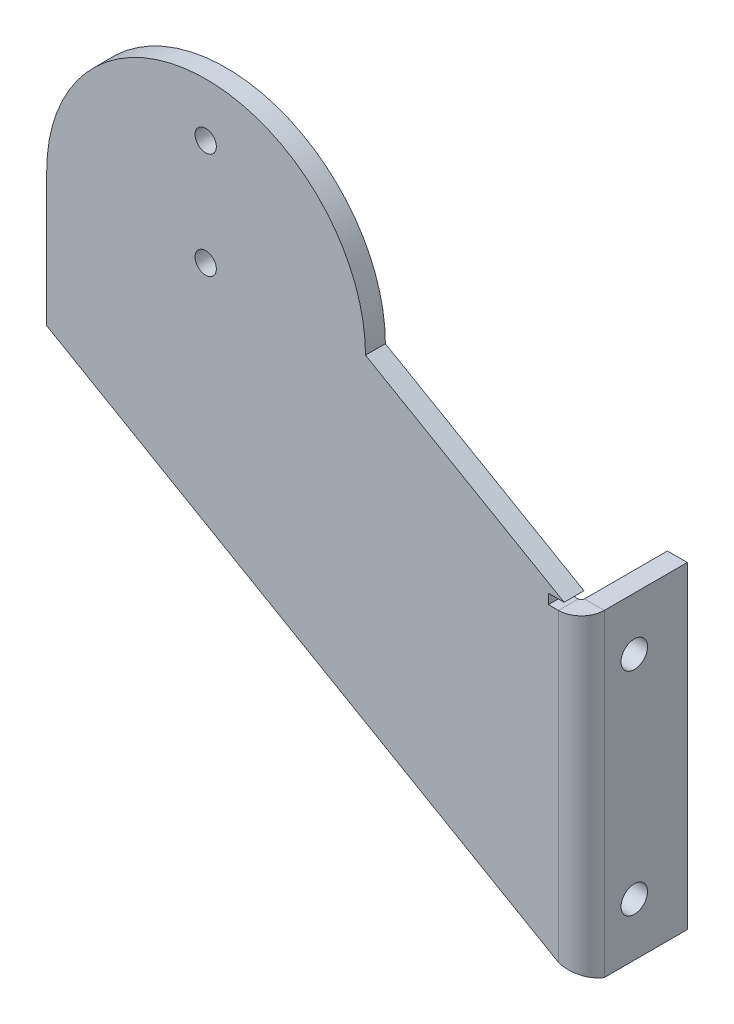
ISO-10303-21;
HEADER;
FILE_DESCRIPTION(('STEP AP214'),'2;1');
FILE_NAME('part.step','',(''),(''),'','','');
FILE_SCHEMA(('AUTOMOTIVE_DESIGN { 1 0 10303 214 1 1 1 1 }'));
ENDSEC;
DATA;
#1=APPLICATION_CONTEXT('core data for automotive mechanical design processes');
#2=APPLICATION_PROTOCOL_DEFINITION('international standard','automotive_design',2000,#1);
#3=PRODUCT_CONTEXT('',#1,'mechanical');
#4=PRODUCT('Part','Part','',(#3));
#5=PRODUCT_RELATED_PRODUCT_CATEGORY('part','',(#4));
#6=PRODUCT_DEFINITION_FORMATION('','',#4);
#7=PRODUCT_DEFINITION_CONTEXT('part definition',#1,'design');
#8=PRODUCT_DEFINITION('design','',#6,#7);
#9=PRODUCT_DEFINITION_SHAPE('','',#8);
#10=(LENGTH_UNIT() NAMED_UNIT(*) SI_UNIT(.MILLI.,.METRE.));
#11=(NAMED_UNIT(*) PLANE_ANGLE_UNIT() SI_UNIT($,.RADIAN.));
#12=(NAMED_UNIT(*) SI_UNIT($,.STERADIAN.) SOLID_ANGLE_UNIT());
#13=UNCERTAINTY_MEASURE_WITH_UNIT(LENGTH_MEASURE(1.E-05),#10,'distance_accuracy_value','');
#14=(GEOMETRIC_REPRESENTATION_CONTEXT(3) GLOBAL_UNCERTAINTY_ASSIGNED_CONTEXT((#13)) GLOBAL_UNIT_ASSIGNED_CONTEXT((#10,
#11,#12)) REPRESENTATION_CONTEXT('',''));
#15=CARTESIAN_POINT('',(0.,0.,0.));
#16=DIRECTION('',(0.,0.,1.));
#17=DIRECTION('',(1.,0.,0.));
#18=AXIS2_PLACEMENT_3D('',#15,#16,#17);
#19=CARTESIAN_POINT('',(0.,0.,-4.7625));
#20=DIRECTION('',(0.499999999999998,0.86602540378444,0.));
#21=DIRECTION('',(-0.86602540378444,0.499999999999998,0.));
#22=AXIS2_PLACEMENT_3D('',#19,#20,#21);
#23=PLANE('',#22);
#24=DIRECTION('',(-0.86602540378444,0.499999999999998,0.));
#25=VECTOR('',#24,1.);
#26=CARTESIAN_POINT('',(0.,0.,0.));
#27=LINE('',#26,#25);
#28=CARTESIAN_POINT('',(47.5931888885804,-27.4779404164144,0.));
#29=VERTEX_POINT('',#28);
#30=CARTESIAN_POINT('',(0.,0.,0.));
#31=VERTEX_POINT('',#30);
#32=EDGE_CURVE('E101',#29,#31,#27,.T.);
#33=ORIENTED_EDGE('',*,*,#32,.F.);
#34=DIRECTION('',(0.,0.,1.));
#35=VECTOR('',#34,1.);
#36=CARTESIAN_POINT('',(47.5931888885804,-27.4779404164144,-4.7625));
#37=LINE('',#36,#35);
#38=CARTESIAN_POINT('',(47.5931888885804,-27.4779404164144,-4.7625));
#39=VERTEX_POINT('',#38);
#40=EDGE_CURVE('E75',#39,#29,#37,.T.);
#41=ORIENTED_EDGE('',*,*,#40,.F.);
#42=DIRECTION('',(-0.86602540378444,0.499999999999998,0.));
#43=VECTOR('',#42,1.);
#44=CARTESIAN_POINT('',(0.,0.,-4.7625));
#45=LINE('',#44,#43);
#46=CARTESIAN_POINT('',(0.,0.,-4.7625));
#47=VERTEX_POINT('',#46);
#48=EDGE_CURVE('E83',#39,#47,#45,.T.);
#49=ORIENTED_EDGE('',*,*,#48,.T.);
#50=DIRECTION('',(0.,0.,1.));
#51=VECTOR('',#50,1.);
#52=CARTESIAN_POINT('',(0.,0.,-4.7625));
#53=LINE('',#52,#51);
#54=EDGE_CURVE('E305',#47,#31,#53,.T.);
#55=ORIENTED_EDGE('',*,*,#54,.T.);
#56=EDGE_LOOP('',(#33,#41,#49,#55));
#57=FACE_BOUND('',#56,.T.);
#58=ADVANCED_FACE('F60',(#57),#23,.T.);
#59=CARTESIAN_POINT('',(51.7176348741038,-106.059190416414,-4.7625));
#60=DIRECTION('',(-0.500000000000004,-0.866025403784436,0.));
#61=DIRECTION('',(0.866025403784437,-0.500000000000004,0.));
#62=AXIS2_PLACEMENT_3D('',#59,#60,#61);
#63=PLANE('',#62);
#64=DIRECTION('',(0.866025403784436,-0.500000000000004,0.));
#65=VECTOR('',#64,1.);
#66=CARTESIAN_POINT('',(51.7176348741038,-106.059190416414,-4.7625));
#67=LINE('',#66,#65);
#68=CARTESIAN_POINT('',(-76.3967302517925,-32.0923272239195,-4.7625));
#69=VERTEX_POINT('',#68);
#70=CARTESIAN_POINT('',(46.2185348741038,-102.884283551114,-4.76250000000001));
#71=VERTEX_POINT('',#70);
#72=EDGE_CURVE('E342',#69,#71,#67,.T.);
#73=ORIENTED_EDGE('',*,*,#72,.T.);
#74=DIRECTION('',(0.,0.,1.));
#75=VECTOR('',#74,1.);
#76=CARTESIAN_POINT('',(46.2185348741038,-102.884283551114,-4.76250000000001));
#77=LINE('',#76,#75);
#78=CARTESIAN_POINT('',(46.2185348741038,-102.884283551114,0.));
#79=VERTEX_POINT('',#78);
#80=EDGE_CURVE('E216',#71,#79,#77,.T.);
#81=ORIENTED_EDGE('',*,*,#80,.T.);
#82=DIRECTION('',(0.866025403784436,-0.500000000000004,0.));
#83=VECTOR('',#82,1.);
#84=CARTESIAN_POINT('',(51.7176348741038,-106.059190416414,0.));
#85=LINE('',#84,#83);
#86=CARTESIAN_POINT('',(-76.3967302517925,-32.0923272239195,0.));
#87=VERTEX_POINT('',#86);
#88=EDGE_CURVE('E290',#87,#79,#85,.T.);
#89=ORIENTED_EDGE('',*,*,#88,.F.);
#90=DIRECTION('',(0.,0.,1.));
#91=VECTOR('',#90,1.);
#92=CARTESIAN_POINT('',(-76.3967302517925,-32.0923272239195,-4.7625));
#93=LINE('',#92,#91);
#94=EDGE_CURVE('E287',#69,#87,#93,.T.);
#95=ORIENTED_EDGE('',*,*,#94,.F.);
#96=EDGE_LOOP('',(#73,#81,#89,#95));
#97=FACE_BOUND('',#96,.T.);
#98=ADVANCED_FACE('F263',(#97),#63,.T.);
#99=CARTESIAN_POINT('',(-38.1983651258962,0.,-4.7625));
#100=DIRECTION('',(0.,0.,1.));
#101=DIRECTION('',(1.,0.,0.));
#102=AXIS2_PLACEMENT_3D('',#99,#100,#101);
#103=PLANE('',#102);
#104=CARTESIAN_POINT('',(-38.2967302517925,25.4,-4.7625));
#105=DIRECTION('',(0.,0.,1.));
#106=DIRECTION('',(1.,0.,0.));
#107=AXIS2_PLACEMENT_3D('',#104,#105,#106);
#108=CIRCLE('',#107,2.5527);
#109=CARTESIAN_POINT('',(-35.7440302517925,25.4,-4.7625));
#110=VERTEX_POINT('',#109);
#111=EDGE_CURVE('E294',#110,#110,#108,.T.);
#112=ORIENTED_EDGE('',*,*,#111,.T.);
#113=EDGE_LOOP('',(#112));
#114=FACE_BOUND('',#113,.T.);
#115=CARTESIAN_POINT('',(-38.2967302517925,0.,-4.7625));
#116=DIRECTION('',(0.,0.,1.));
#117=DIRECTION('',(1.,0.,0.));
#118=AXIS2_PLACEMENT_3D('',#115,#116,#117);
#119=CIRCLE('',#118,2.5527);
#120=CARTESIAN_POINT('',(-35.7440302517925,0.,-4.7625));
#121=VERTEX_POINT('',#120);
#122=EDGE_CURVE('E334',#121,#121,#119,.T.);
#123=ORIENTED_EDGE('',*,*,#122,.T.);
#124=EDGE_LOOP('',(#123));
#125=FACE_BOUND('',#124,.T.);
#126=DIRECTION('',(0.,-1.,0.));
#127=VECTOR('',#126,1.);
#128=CARTESIAN_POINT('',(46.2185348741038,-106.059190416414,-4.76250000000001));
#129=LINE('',#128,#127);
#130=CARTESIAN_POINT('',(46.2185348741038,-29.8591904164144,-4.76250000000001));
#131=VERTEX_POINT('',#130);
#132=EDGE_CURVE('E219',#71,#131,#129,.F.);
#133=ORIENTED_EDGE('',*,*,#132,.F.);
#134=ORIENTED_EDGE('',*,*,#72,.F.);
#135=DIRECTION('',(0.,-1.,0.));
#136=VECTOR('',#135,1.);
#137=CARTESIAN_POINT('',(-76.3967302517925,-32.0923272239195,-4.7625));
#138=LINE('',#137,#136);
#139=CARTESIAN_POINT('',(-76.3967302517925,0.,-4.7625));
#140=VERTEX_POINT('',#139);
#141=EDGE_CURVE('E341',#140,#69,#138,.T.);
#142=ORIENTED_EDGE('',*,*,#141,.F.);
#143=CARTESIAN_POINT('',(-38.1983651258962,0.,-4.7625));
#144=DIRECTION('',(0.,0.,1.));
#145=DIRECTION('',(1.,0.,0.));
#146=AXIS2_PLACEMENT_3D('',#143,#144,#145);
#147=CIRCLE('',#146,38.1983651258962);
#148=EDGE_CURVE('E304',#47,#140,#147,.T.);
#149=ORIENTED_EDGE('',*,*,#148,.F.);
#150=ORIENTED_EDGE('',*,*,#48,.F.);
#151=DIRECTION('',(1.,0.,0.));
#152=VECTOR('',#151,1.);
#153=CARTESIAN_POINT('',(43.8372848741038,-27.4779404164144,-4.76250000000001));
#154=LINE('',#153,#152);
#155=CARTESIAN_POINT('',(43.8372848741038,-27.4779404164144,-4.76250000000001));
#156=VERTEX_POINT('',#155);
#157=EDGE_CURVE('E327',#156,#39,#154,.T.);
#158=ORIENTED_EDGE('',*,*,#157,.F.);
#159=DIRECTION('',(0.,1.,0.));
#160=VECTOR('',#159,1.);
#161=CARTESIAN_POINT('',(43.8372848741038,-29.8591904164144,-4.76250000000001));
#162=LINE('',#161,#160);
#163=CARTESIAN_POINT('',(43.8372848741038,-29.8591904164144,-4.76250000000001));
#164=VERTEX_POINT('',#163);
#165=EDGE_CURVE('E324',#164,#156,#162,.T.);
#166=ORIENTED_EDGE('',*,*,#165,.F.);
#167=DIRECTION('',(-1.,0.,0.));
#168=VECTOR('',#167,1.);
#169=CARTESIAN_POINT('',(46.2185348741038,-29.8591904164144,-4.76250000000001));
#170=LINE('',#169,#168);
#171=EDGE_CURVE('E322',#131,#164,#170,.T.);
#172=ORIENTED_EDGE('',*,*,#171,.F.);
#173=EDGE_LOOP('',(#133,#134,#142,#149,#150,#158,#166,#172));
#174=FACE_BOUND('',#173,.T.);
#175=ADVANCED_FACE('F268',(#114,#125,#174),#103,.F.);
#176=CARTESIAN_POINT('',(-38.1983651258962,0.,0.));
#177=DIRECTION('',(0.,0.,1.));
#178=DIRECTION('',(1.,0.,0.));
#179=AXIS2_PLACEMENT_3D('',#176,#177,#178);
#180=PLANE('',#179);
#181=CARTESIAN_POINT('',(-38.2967302517925,0.,0.));
#182=DIRECTION('',(0.,0.,1.));
#183=DIRECTION('',(1.,0.,0.));
#184=AXIS2_PLACEMENT_3D('',#181,#182,#183);
#185=CIRCLE('',#184,2.5527);
#186=CARTESIAN_POINT('',(-35.7440302517925,0.,0.));
#187=VERTEX_POINT('',#186);
#188=EDGE_CURVE('E331',#187,#187,#185,.T.);
#189=ORIENTED_EDGE('',*,*,#188,.F.);
#190=EDGE_LOOP('',(#189));
#191=FACE_BOUND('',#190,.T.);
#192=CARTESIAN_POINT('',(-38.2967302517925,25.4,0.));
#193=DIRECTION('',(0.,0.,1.));
#194=DIRECTION('',(1.,0.,0.));
#195=AXIS2_PLACEMENT_3D('',#192,#193,#194);
#196=CIRCLE('',#195,2.5527);
#197=CARTESIAN_POINT('',(-35.7440302517925,25.4,0.));
#198=VERTEX_POINT('',#197);
#199=EDGE_CURVE('E297',#198,#198,#196,.T.);
#200=ORIENTED_EDGE('',*,*,#199,.F.);
#201=EDGE_LOOP('',(#200));
#202=FACE_BOUND('',#201,.T.);
#203=ORIENTED_EDGE('',*,*,#88,.T.);
#204=DIRECTION('',(0.,-1.,0.));
#205=VECTOR('',#204,1.);
#206=CARTESIAN_POINT('',(46.2185348741038,-106.059190416414,0.));
#207=LINE('',#206,#205);
#208=CARTESIAN_POINT('',(46.2185348741038,-29.8591904164144,0.));
#209=VERTEX_POINT('',#208);
#210=EDGE_CURVE('E165',#79,#209,#207,.F.);
#211=ORIENTED_EDGE('',*,*,#210,.T.);
#212=DIRECTION('',(-1.,0.,0.));
#213=VECTOR('',#212,1.);
#214=CARTESIAN_POINT('',(-38.1983651258962,-29.8591904164144,0.));
#215=LINE('',#214,#213);
#216=CARTESIAN_POINT('',(43.8372848741038,-29.8591904164144,0.));
#217=VERTEX_POINT('',#216);
#218=EDGE_CURVE('E13',#209,#217,#215,.T.);
#219=ORIENTED_EDGE('',*,*,#218,.T.);
#220=DIRECTION('',(0.,1.,0.));
#221=VECTOR('',#220,1.);
#222=CARTESIAN_POINT('',(43.8372848741038,0.,0.));
#223=LINE('',#222,#221);
#224=CARTESIAN_POINT('',(43.8372848741038,-27.4779404164144,0.));
#225=VERTEX_POINT('',#224);
#226=EDGE_CURVE('E68',#217,#225,#223,.T.);
#227=ORIENTED_EDGE('',*,*,#226,.T.);
#228=DIRECTION('',(1.,0.,0.));
#229=VECTOR('',#228,1.);
#230=CARTESIAN_POINT('',(-38.1983651258962,-27.4779404164144,0.));
#231=LINE('',#230,#229);
#232=EDGE_CURVE('E307',#225,#29,#231,.T.);
#233=ORIENTED_EDGE('',*,*,#232,.T.);
#234=ORIENTED_EDGE('',*,*,#32,.T.);
#235=CARTESIAN_POINT('',(-38.1983651258962,0.,0.));
#236=DIRECTION('',(0.,0.,1.));
#237=DIRECTION('',(1.,0.,0.));
#238=AXIS2_PLACEMENT_3D('',#235,#236,#237);
#239=CIRCLE('',#238,38.1983651258962);
#240=CARTESIAN_POINT('',(-76.3967302517925,0.,0.));
#241=VERTEX_POINT('',#240);
#242=EDGE_CURVE('E291',#31,#241,#239,.T.);
#243=ORIENTED_EDGE('',*,*,#242,.T.);
#244=DIRECTION('',(0.,-1.,0.));
#245=VECTOR('',#244,1.);
#246=CARTESIAN_POINT('',(-76.3967302517925,-32.0923272239195,0.));
#247=LINE('',#246,#245);
#248=EDGE_CURVE('E286',#241,#87,#247,.T.);
#249=ORIENTED_EDGE('',*,*,#248,.T.);
#250=EDGE_LOOP('',(#203,#211,#219,#227,#233,#234,#243,#249));
#251=FACE_BOUND('',#250,.T.);
#252=ADVANCED_FACE('F272',(#191,#202,#251),#180,.T.);
#253=CARTESIAN_POINT('',(-38.1983651258962,0.,-4.7625));
#254=DIRECTION('',(0.,0.,1.));
#255=DIRECTION('',(1.,0.,0.));
#256=AXIS2_PLACEMENT_3D('',#253,#254,#255);
#257=CYLINDRICAL_SURFACE('',#256,38.1983651258962);
#258=ORIENTED_EDGE('',*,*,#242,.F.);
#259=ORIENTED_EDGE('',*,*,#54,.F.);
#260=ORIENTED_EDGE('',*,*,#148,.T.);
#261=DIRECTION('',(0.,0.,1.));
#262=VECTOR('',#261,1.);
#263=CARTESIAN_POINT('',(-76.3967302517925,0.,-4.7625));
#264=LINE('',#263,#262);
#265=EDGE_CURVE('E106',#140,#241,#264,.T.);
#266=ORIENTED_EDGE('',*,*,#265,.T.);
#267=EDGE_LOOP('',(#258,#259,#260,#266));
#268=FACE_BOUND('',#267,.T.);
#269=ADVANCED_FACE('F62',(#268),#257,.T.);
#270=CARTESIAN_POINT('',(-76.3967302517925,-32.0923272239195,-4.7625));
#271=DIRECTION('',(-1.,0.,0.));
#272=DIRECTION('',(0.,0.,1.));
#273=AXIS2_PLACEMENT_3D('',#270,#271,#272);
#274=PLANE('',#273);
#275=ORIENTED_EDGE('',*,*,#248,.F.);
#276=ORIENTED_EDGE('',*,*,#265,.F.);
#277=ORIENTED_EDGE('',*,*,#141,.T.);
#278=ORIENTED_EDGE('',*,*,#94,.T.);
#279=EDGE_LOOP('',(#275,#276,#277,#278));
#280=FACE_BOUND('',#279,.T.);
#281=ADVANCED_FACE('F274',(#280),#274,.T.);
#282=CARTESIAN_POINT('',(-38.2967302517925,25.4,0.));
#283=DIRECTION('',(0.,0.,1.));
#284=DIRECTION('',(1.,0.,0.));
#285=AXIS2_PLACEMENT_3D('',#282,#283,#284);
#286=CYLINDRICAL_SURFACE('',#285,2.5527);
#287=ORIENTED_EDGE('',*,*,#111,.F.);
#288=EDGE_LOOP('',(#287));
#289=FACE_BOUND('',#288,.T.);
#290=ORIENTED_EDGE('',*,*,#199,.T.);
#291=EDGE_LOOP('',(#290));
#292=FACE_BOUND('',#291,.T.);
#293=ADVANCED_FACE('F276',(#289,#292),#286,.F.);
#294=CARTESIAN_POINT('',(-38.2967302517925,0.,0.));
#295=DIRECTION('',(0.,0.,1.));
#296=DIRECTION('',(1.,0.,0.));
#297=AXIS2_PLACEMENT_3D('',#294,#295,#296);
#298=CYLINDRICAL_SURFACE('',#297,2.5527);
#299=ORIENTED_EDGE('',*,*,#122,.F.);
#300=EDGE_LOOP('',(#299));
#301=FACE_BOUND('',#300,.T.);
#302=ORIENTED_EDGE('',*,*,#188,.T.);
#303=EDGE_LOOP('',(#302));
#304=FACE_BOUND('',#303,.T.);
#305=ADVANCED_FACE('F281',(#301,#304),#298,.F.);
#306=CARTESIAN_POINT('',(46.2185348741038,-29.8591904164144,-4.76250000000001));
#307=DIRECTION('',(0.,1.,0.));
#308=DIRECTION('',(0.,0.,1.));
#309=AXIS2_PLACEMENT_3D('',#306,#307,#308);
#310=PLANE('',#309);
#311=ORIENTED_EDGE('',*,*,#218,.F.);
#312=DIRECTION('',(0.,0.,1.));
#313=VECTOR('',#312,1.);
#314=CARTESIAN_POINT('',(46.2185348741038,-29.8591904164144,-4.76250000000001));
#315=LINE('',#314,#313);
#316=EDGE_CURVE('E222',#131,#209,#315,.T.);
#317=ORIENTED_EDGE('',*,*,#316,.F.);
#318=ORIENTED_EDGE('',*,*,#171,.T.);
#319=DIRECTION('',(0.,0.,1.));
#320=VECTOR('',#319,1.);
#321=CARTESIAN_POINT('',(43.8372848741038,-29.8591904164144,-4.76250000000001));
#322=LINE('',#321,#320);
#323=EDGE_CURVE('E316',#164,#217,#322,.T.);
#324=ORIENTED_EDGE('',*,*,#323,.T.);
#325=EDGE_LOOP('',(#311,#317,#318,#324));
#326=FACE_BOUND('',#325,.T.);
#327=ADVANCED_FACE('F319',(#326),#310,.T.);
#328=CARTESIAN_POINT('',(43.8372848741038,-29.8591904164144,-4.76250000000001));
#329=DIRECTION('',(1.,0.,0.));
#330=DIRECTION('',(0.,0.,-1.));
#331=AXIS2_PLACEMENT_3D('',#328,#329,#330);
#332=PLANE('',#331);
#333=ORIENTED_EDGE('',*,*,#226,.F.);
#334=ORIENTED_EDGE('',*,*,#323,.F.);
#335=ORIENTED_EDGE('',*,*,#165,.T.);
#336=DIRECTION('',(0.,0.,1.));
#337=VECTOR('',#336,1.);
#338=CARTESIAN_POINT('',(43.8372848741038,-27.4779404164144,-4.76250000000001));
#339=LINE('',#338,#337);
#340=EDGE_CURVE('E225',#156,#225,#339,.T.);
#341=ORIENTED_EDGE('',*,*,#340,.T.);
#342=EDGE_LOOP('',(#333,#334,#335,#341));
#343=FACE_BOUND('',#342,.T.);
#344=ADVANCED_FACE('F261',(#343),#332,.T.);
#345=CARTESIAN_POINT('',(43.8372848741038,-27.4779404164144,-4.76250000000001));
#346=DIRECTION('',(0.,-1.,0.));
#347=DIRECTION('',(0.,0.,-1.));
#348=AXIS2_PLACEMENT_3D('',#345,#346,#347);
#349=PLANE('',#348);
#350=ORIENTED_EDGE('',*,*,#232,.F.);
#351=ORIENTED_EDGE('',*,*,#340,.F.);
#352=ORIENTED_EDGE('',*,*,#157,.T.);
#353=ORIENTED_EDGE('',*,*,#40,.T.);
#354=EDGE_LOOP('',(#350,#351,#352,#353));
#355=FACE_BOUND('',#354,.T.);
#356=ADVANCED_FACE('F255',(#355),#349,.T.);
#357=CARTESIAN_POINT('',(46.2185348741038,-29.8591904164144,-5.4991));
#358=DIRECTION('',(0.,1.,0.));
#359=DIRECTION('',(0.,0.,1.));
#360=AXIS2_PLACEMENT_3D('',#357,#358,#359);
#361=PLANE('',#360);
#362=DIRECTION('',(1.,0.,0.));
#363=VECTOR('',#362,1.);
#364=CARTESIAN_POINT('',(51.7176348741038,-29.8591904164144,-5.49909999999999));
#365=LINE('',#364,#363);
#366=CARTESIAN_POINT('',(46.9551348741038,-29.8591904164144,-5.4991));
#367=VERTEX_POINT('',#366);
#368=CARTESIAN_POINT('',(51.7176348741038,-29.8591904164144,-5.49909999999998));
#369=VERTEX_POINT('',#368);
#370=EDGE_CURVE('E210',#367,#369,#365,.T.);
#371=ORIENTED_EDGE('',*,*,#370,.F.);
#372=CARTESIAN_POINT('',(46.2185348741038,-29.8591904164144,-5.4991));
#373=DIRECTION('',(0.,-1.,0.));
#374=DIRECTION('',(0.,0.,-1.));
#375=AXIS2_PLACEMENT_3D('',#372,#373,#374);
#376=CIRCLE('',#375,0.73659999999999);
#377=EDGE_CURVE('E168',#131,#367,#376,.F.);
#378=ORIENTED_EDGE('',*,*,#377,.F.);
#379=ORIENTED_EDGE('',*,*,#316,.T.);
#380=CARTESIAN_POINT('',(46.2185348741038,-29.8591904164144,-5.4991));
#381=DIRECTION('',(0.,-1.,0.));
#382=DIRECTION('',(0.,0.,-1.));
#383=AXIS2_PLACEMENT_3D('',#380,#381,#382);
#384=CIRCLE('',#383,5.49909999999999);
#385=EDGE_CURVE('E214',#209,#369,#384,.F.);
#386=ORIENTED_EDGE('',*,*,#385,.T.);
#387=EDGE_LOOP('',(#371,#378,#379,#386));
#388=FACE_BOUND('',#387,.T.);
#389=ADVANCED_FACE('F253',(#388),#361,.T.);
#390=CARTESIAN_POINT('',(51.7652598741038,-106.059190416414,-5.49909999999995));
#391=CARTESIAN_POINT('',(51.7652598741038,-105.79457245508,-4.77291993524793));
#392=CARTESIAN_POINT('',(51.6208934690968,-105.530039272198,-4.04725646612724));
#393=CARTESIAN_POINT('',(51.065187679048,-105.000888127981,-2.7056640111022));
#394=CARTESIAN_POINT('',(50.6540669405048,-104.736312555872,-2.09037834464712));
#395=CARTESIAN_POINT('',(49.6272565294566,-104.207161411656,-1.06356793359894));
#396=CARTESIAN_POINT('',(49.0119708630015,-103.942585839547,-0.652447195055731));
#397=CARTESIAN_POINT('',(47.6703784079765,-103.41343469533,-0.0967414050069448));
#398=CARTESIAN_POINT('',(46.9447149388558,-103.148901512449,0.0476249999999913));
#399=CARTESIAN_POINT('',(46.2185348741038,-102.884283551114,0.0476249999999913));
#400=CARTESIAN_POINT('',(51.7176348741038,-106.059190416414,-5.49909999999995));
#401=CARTESIAN_POINT('',(51.7176348741038,-105.794572819402,-4.77915515615928));
#402=CARTESIAN_POINT('',(51.5745080203705,-105.530039272198,-4.05972220911985));
#403=CARTESIAN_POINT('',(51.0235736023026,-105.000888127981,-2.72964886504236));
#404=CARTESIAN_POINT('',(50.6159828071356,-104.736312555872,-2.11964613218592));
#405=CARTESIAN_POINT('',(49.5979887419178,-104.207161411656,-1.10165206696815));
#406=CARTESIAN_POINT('',(48.9879860090614,-103.942585839547,-0.694061271801102));
#407=CARTESIAN_POINT('',(47.6579126649839,-103.41343469533,-0.143126853733273));
#408=CARTESIAN_POINT('',(46.9384797179444,-103.148901148127,0.));
#409=CARTESIAN_POINT('',(46.2185348741038,-102.884283551114,0.));
#410=CARTESIAN_POINT('',(46.9551348741038,-106.059190416414,-5.49909999999999));
#411=CARTESIAN_POINT('',(46.9551348741038,-105.794609251602,-5.40267724729413));
#412=CARTESIAN_POINT('',(46.9359631477376,-105.530039272198,-5.30629650838095));
#413=CARTESIAN_POINT('',(46.8621659277655,-105.000888127981,-5.1281342590588));
#414=CARTESIAN_POINT('',(46.8075694702143,-104.736312555872,-5.04642488606648));
#415=CARTESIAN_POINT('',(46.6712099880373,-104.207161411656,-4.91006540388951));
#416=CARTESIAN_POINT('',(46.589500615045,-103.942585839547,-4.85546894633826));
#417=CARTESIAN_POINT('',(46.4113383657228,-103.41343469533,-4.78167172636613));
#418=CARTESIAN_POINT('',(46.3149576268096,-103.148864715926,-4.76250000000001));
#419=CARTESIAN_POINT('',(46.2185348741038,-102.884283551114,-4.76250000000001));
#420=CARTESIAN_POINT('',(46.9070336241038,-106.059190416414,-5.49909999999999));
#421=CARTESIAN_POINT('',(46.9070336241038,-105.794609619567,-5.40897482041459));
#422=CARTESIAN_POINT('',(46.889113844524,-105.530039272198,-5.31888690880349));
#423=CARTESIAN_POINT('',(46.8201357102527,-105.000888127981,-5.15235896153836));
#424=CARTESIAN_POINT('',(46.7691044955113,-104.736312555872,-5.07598535148067));
#425=CARTESIAN_POINT('',(46.6416495226231,-104.207161411656,-4.94853037859241));
#426=CARTESIAN_POINT('',(46.5652759125654,-103.942585839547,-4.89749916385109));
#427=CARTESIAN_POINT('',(46.3987479653003,-103.41343469533,-4.82852102957972));
#428=CARTESIAN_POINT('',(46.3086600536892,-103.148864347961,-4.81060125000001));
#429=CARTESIAN_POINT('',(46.2185348741038,-102.884283551114,-4.81060125000001));
#430=B_SPLINE_SURFACE_WITH_KNOTS('',1,3,((#390,#391,#392,#393,#394,#395,#396,#397,#398,#399),
(#400,#401,#402,#403,#404,#405,#406,#407,#408,#409),(#410,#411,#412,#413,#414,#415,#416,#417,
#418,#419),(#420,#421,#422,#423,#424,#425,#426,#427,#428,#429)),.UNSPECIFIED.,.F.,.F.,.F.,(2,1,
1,2),(4,2,2,2,4),(-0.01,0.,1.,1.0101),(0.,0.25,0.5,0.75,1.),.UNSPECIFIED.);
#431=CARTESIAN_POINT('',(46.9551348741038,-106.059190416414,-5.49909999999999));
#432=CARTESIAN_POINT('',(46.9551742841148,-105.942640938276,-5.45662098982252));
#433=CARTESIAN_POINT('',(46.9514627100518,-105.826092859451,-5.41415138640345));
#434=CARTESIAN_POINT('',(46.9368190925889,-105.592990307711,-5.33047059549351));
#435=CARTESIAN_POINT('',(46.9258866358114,-105.476435834812,-5.28925948018925));
#436=CARTESIAN_POINT('',(46.8971177852329,-105.243607689677,-5.2094374537906));
#437=CARTESIAN_POINT('',(46.87929822136,-105.127334022879,-5.17082047140903));
#438=CARTESIAN_POINT('',(46.8372980299475,-104.894814382594,-5.0972218962019));
#439=CARTESIAN_POINT('',(46.8131185814618,-104.778568407967,-5.06223963121414));
#440=CARTESIAN_POINT('',(46.752066324939,-104.515750273345,-4.98843977667916));
#441=CARTESIAN_POINT('',(46.713527701547,-104.369172817556,-4.9509999375264));
#442=CARTESIAN_POINT('',(46.6292860588606,-104.076070378329,-4.88532828642159));
#443=CARTESIAN_POINT('',(46.5835849353405,-103.929545391258,-4.85709404400127));
#444=CARTESIAN_POINT('',(46.486117874067,-103.633290753712,-4.81065681573478));
#445=CARTESIAN_POINT('',(46.4342417655512,-103.483560624576,-4.79268503648683));
#446=CARTESIAN_POINT('',(46.3543946423234,-103.258928147394,-4.77462112477924));
#447=CARTESIAN_POINT('',(46.3274242393628,-103.184001951083,-4.77008206721029));
#448=CARTESIAN_POINT('',(46.2731477541238,-103.034147856374,-4.76401914656466));
#449=CARTESIAN_POINT('',(46.2458416666212,-102.959219957968,-4.7624953304742));
#450=CARTESIAN_POINT('',(46.2185348741038,-102.884283551114,-4.76250000000001));
#451=B_SPLINE_CURVE_WITH_KNOTS('',3,(#431,#432,#433,#434,#435,#436,#437,#438,#439,#440,#441,
#442,#443,#444,#445,#446,#447,#448,#449,#450),.UNSPECIFIED.,.F.,.F.,(4,2,2,2,2,2,2,2,2,4),(0.,
0.372085991624271,0.744193286089373,1.11539695854581,1.4865318622905,1.95442337994525,
2.42219126432299,2.90011939807592,3.1393548883346,3.37859410654714),.UNSPECIFIED.);
#452=CARTESIAN_POINT('',(46.9551348741038,-106.059190416414,-5.4991));
#453=VERTEX_POINT('',#452);
#454=EDGE_CURVE('E175',#453,#71,#451,.T.);
#455=DIRECTION('',(1.,0.,0.));
#456=VECTOR('',#455,1.);
#457=CARTESIAN_POINT('',(46.9551348741038,-106.059190416414,-5.49909999999999));
#458=LINE('',#457,#456);
#459=CARTESIAN_POINT('',(51.7176348741038,-106.059190416414,-5.49909999999998));
#460=VERTEX_POINT('',#459);
#461=EDGE_CURVE('E172',#453,#460,#458,.T.);
#462=CARTESIAN_POINT('',(51.7176348741038,-106.059190416414,-5.49909999999995));
#463=CARTESIAN_POINT('',(51.7176717679547,-105.990011040452,-5.3108949216164));
#464=CARTESIAN_POINT('',(51.7079747329104,-105.920835058812,-5.12269375538517));
#465=CARTESIAN_POINT('',(51.6693748285333,-105.782483826167,-4.74826144444336));
#466=CARTESIAN_POINT('',(51.6404711910946,-105.713308575301,-4.56203037882318));
#467=CARTESIAN_POINT('',(51.5638073022179,-105.575115388434,-4.19393431710489));
#468=CARTESIAN_POINT('',(51.5160900266397,-105.506097451967,-4.01206036550447));
#469=CARTESIAN_POINT('',(51.4023146287427,-105.36806630915,-3.65416997540624));
#470=CARTESIAN_POINT('',(51.3362596174907,-105.299053103982,-3.47815254899402));
#471=CARTESIAN_POINT('',(51.1956386858458,-105.169447437912,-3.15480288763259));
#472=CARTESIAN_POINT('',(51.1230911068823,-105.108853762004,-3.00658907937503));
#473=CARTESIAN_POINT('',(50.9649769019025,-104.987670934873,-2.71727344425099));
#474=CARTESIAN_POINT('',(50.8794106957553,-104.927081783566,-2.57617138821581));
#475=CARTESIAN_POINT('',(50.6960014996457,-104.805936781491,-2.30229817947237));
#476=CARTESIAN_POINT('',(50.5981651683041,-104.745380930418,-2.16952256644051));
#477=CARTESIAN_POINT('',(50.3909687224911,-104.624263345707,-1.91328864180913));
#478=CARTESIAN_POINT('',(50.2816084542208,-104.563701612001,-1.78983045459808));
#479=CARTESIAN_POINT('',(50.0522687808792,-104.442590501455,-1.55325133887448));
#480=CARTESIAN_POINT('',(49.9322913843632,-104.382041124441,-1.44012846331595));
#481=CARTESIAN_POINT('',(49.682667616084,-104.260944042659,-1.22510633079348));
#482=CARTESIAN_POINT('',(49.5530212334574,-104.200396337893,-1.1232070864399));
#483=CARTESIAN_POINT('',(49.2850164051479,-104.079264458101,-0.931391104575049));
#484=CARTESIAN_POINT('',(49.146652244949,-104.018680285488,-0.841482349740199));
#485=CARTESIAN_POINT('',(48.8624150531932,-103.897508663357,-0.674458080750675));
#486=CARTESIAN_POINT('',(48.7165422776119,-103.836921214022,-0.597342130855622));
#487=CARTESIAN_POINT('',(48.4183607172232,-103.715705793481,-0.456474226121126));
#488=CARTESIAN_POINT('',(48.2660476622772,-103.655077822477,-0.392731310484295));
#489=CARTESIAN_POINT('',(47.9563126670354,-103.533822684167,-0.279192571925596));
#490=CARTESIAN_POINT('',(47.7988908802559,-103.473195516891,-0.229396330341792));
#491=CARTESIAN_POINT('',(47.4804745329558,-103.352047880207,-0.144220917794975));
#492=CARTESIAN_POINT('',(47.3194862329035,-103.291527398378,-0.10881831445711));
#493=CARTESIAN_POINT('',(46.9950504990635,-103.17050912865,-0.0526145945344281));
#494=CARTESIAN_POINT('',(46.8316044855166,-103.110011346897,-0.0318053528323465));
#495=CARTESIAN_POINT('',(46.5928659791819,-103.021966237878,-0.0122424303553993));
#496=CARTESIAN_POINT('',(46.5180165300163,-102.99440796488,-0.00764891939444265));
#497=CARTESIAN_POINT('',(46.3682926474383,-102.939328528548,-0.00152986890260441));
#498=CARTESIAN_POINT('',(46.2934183816947,-102.911807364936,-2.29381061079946E-07));
#499=CARTESIAN_POINT('',(46.2185348741038,-102.884283551114,0.));
#500=B_SPLINE_CURVE_WITH_KNOTS('',3,(#462,#463,#464,#465,#466,#467,#468,#469,#470,#471,#472,
#473,#474,#475,#476,#477,#478,#479,#480,#481,#482,#483,#484,#485,#486,#487,#488,#489,#490,#491,
#492,#493,#494,#495,#496,#497,#498,#499),.UNSPECIFIED.,.F.,.F.,(4,2,2,2,2,2,2,2,2,2,2,2,2,2,2,2,
2,2,4),(0.,0.601309558772236,1.20264316641987,1.80261103711254,2.40247718310315,
2.92923646479338,3.45597876135545,3.9824364379539,4.50890114156626,5.03526646029319,
5.56163237041415,6.08834697803042,6.6150436413437,7.14209517455102,7.6691308846258,
8.19530512865214,8.72118618259544,8.96081798325742,9.20012890025645),.UNSPECIFIED.);
#501=EDGE_CURVE('E158',#460,#79,#500,.T.);
#502=ORIENTED_EDGE('',*,*,#454,.F.);
#503=ORIENTED_EDGE('',*,*,#461,.T.);
#504=ORIENTED_EDGE('',*,*,#501,.T.);
#505=ORIENTED_EDGE('',*,*,#80,.F.);
#506=EDGE_LOOP('',(#502,#503,#504,#505));
#507=FACE_BOUND('',#506,.T.);
#508=ADVANCED_FACE('F173',(#507),#430,.F.);
#509=CARTESIAN_POINT('',(46.2185348741038,-106.059190416414,-5.4991));
#510=DIRECTION('',(0.,-1.,0.));
#511=DIRECTION('',(1.,0.,0.));
#512=AXIS2_PLACEMENT_3D('',#509,#510,#511);
#513=CYLINDRICAL_SURFACE('',#512,5.49909999999999);
#514=ORIENTED_EDGE('',*,*,#210,.F.);
#515=ORIENTED_EDGE('',*,*,#501,.F.);
#516=DIRECTION('',(0.,-1.,0.));
#517=VECTOR('',#516,1.);
#518=CARTESIAN_POINT('',(51.7176348741038,0.,-5.49909999999999));
#519=LINE('',#518,#517);
#520=EDGE_CURVE('E162',#369,#460,#519,.T.);
#521=ORIENTED_EDGE('',*,*,#520,.F.);
#522=ORIENTED_EDGE('',*,*,#385,.F.);
#523=EDGE_LOOP('',(#514,#515,#521,#522));
#524=FACE_BOUND('',#523,.T.);
#525=ADVANCED_FACE('F160',(#524),#513,.T.);
#526=CARTESIAN_POINT('',(46.2185348741038,-106.059190416414,-5.4991));
#527=DIRECTION('',(0.,-1.,0.));
#528=DIRECTION('',(1.,0.,0.));
#529=AXIS2_PLACEMENT_3D('',#526,#527,#528);
#530=CYLINDRICAL_SURFACE('',#529,0.73659999999999);
#531=ORIENTED_EDGE('',*,*,#132,.T.);
#532=ORIENTED_EDGE('',*,*,#377,.T.);
#533=DIRECTION('',(0.,1.,0.));
#534=VECTOR('',#533,1.);
#535=CARTESIAN_POINT('',(46.9551348741038,-29.8591904164144,-5.4991));
#536=LINE('',#535,#534);
#537=EDGE_CURVE('E180',#367,#453,#536,.F.);
#538=ORIENTED_EDGE('',*,*,#537,.T.);
#539=ORIENTED_EDGE('',*,*,#454,.T.);
#540=EDGE_LOOP('',(#531,#532,#538,#539));
#541=FACE_BOUND('',#540,.T.);
#542=ADVANCED_FACE('F247',(#541),#530,.F.);
#543=CARTESIAN_POINT('',(51.7176348741038,-106.059190416414,-4.76249999999998));
#544=DIRECTION('',(0.,-1.,0.));
#545=DIRECTION('',(0.,0.,-1.));
#546=AXIS2_PLACEMENT_3D('',#543,#544,#545);
#547=PLANE('',#546);
#548=DIRECTION('',(0.,0.,1.));
#549=VECTOR('',#548,1.);
#550=CARTESIAN_POINT('',(51.7176348741038,-106.059190416414,-4.76249999999998));
#551=LINE('',#550,#549);
#552=CARTESIAN_POINT('',(51.7176348741038,-106.059190416414,-25.4));
#553=VERTEX_POINT('',#552);
#554=EDGE_CURVE('E187',#553,#460,#551,.T.);
#555=ORIENTED_EDGE('',*,*,#554,.T.);
#556=ORIENTED_EDGE('',*,*,#461,.F.);
#557=DIRECTION('',(0.,0.,-1.));
#558=VECTOR('',#557,1.);
#559=CARTESIAN_POINT('',(46.9551348741037,-106.059190416414,0.));
#560=LINE('',#559,#558);
#561=CARTESIAN_POINT('',(46.9551348741038,-106.059190416414,-25.4));
#562=VERTEX_POINT('',#561);
#563=EDGE_CURVE('E203',#562,#453,#560,.F.);
#564=ORIENTED_EDGE('',*,*,#563,.F.);
#565=DIRECTION('',(-1.,0.,0.));
#566=VECTOR('',#565,1.);
#567=CARTESIAN_POINT('',(51.7176348741038,-106.059190416414,-25.4));
#568=LINE('',#567,#566);
#569=EDGE_CURVE('E192',#553,#562,#568,.T.);
#570=ORIENTED_EDGE('',*,*,#569,.F.);
#571=EDGE_LOOP('',(#555,#556,#564,#570));
#572=FACE_BOUND('',#571,.T.);
#573=ADVANCED_FACE('F191',(#572),#547,.T.);
#574=CARTESIAN_POINT('',(51.7176348741038,-29.8591904164144,-25.4));
#575=DIRECTION('',(0.,1.,0.));
#576=DIRECTION('',(0.,0.,1.));
#577=AXIS2_PLACEMENT_3D('',#574,#575,#576);
#578=PLANE('',#577);
#579=DIRECTION('',(0.,0.,1.));
#580=VECTOR('',#579,1.);
#581=CARTESIAN_POINT('',(46.9551348741037,-29.8591904164144,1.51119853540998E-13));
#582=LINE('',#581,#580);
#583=CARTESIAN_POINT('',(46.9551348741038,-29.8591904164144,-25.4));
#584=VERTEX_POINT('',#583);
#585=EDGE_CURVE('E189',#367,#584,#582,.F.);
#586=ORIENTED_EDGE('',*,*,#585,.F.);
#587=ORIENTED_EDGE('',*,*,#370,.T.);
#588=DIRECTION('',(0.,0.,-1.));
#589=VECTOR('',#588,1.);
#590=CARTESIAN_POINT('',(51.7176348741038,-29.8591904164144,-25.4));
#591=LINE('',#590,#589);
#592=CARTESIAN_POINT('',(51.7176348741038,-29.8591904164144,-25.4));
#593=VERTEX_POINT('',#592);
#594=EDGE_CURVE('E188',#369,#593,#591,.T.);
#595=ORIENTED_EDGE('',*,*,#594,.T.);
#596=DIRECTION('',(-1.,0.,0.));
#597=VECTOR('',#596,1.);
#598=CARTESIAN_POINT('',(51.7176348741038,-29.8591904164144,-25.4));
#599=LINE('',#598,#597);
#600=EDGE_CURVE('E194',#593,#584,#599,.T.);
#601=ORIENTED_EDGE('',*,*,#600,.T.);
#602=EDGE_LOOP('',(#586,#587,#595,#601));
#603=FACE_BOUND('',#602,.T.);
#604=ADVANCED_FACE('F248',(#603),#578,.T.);
#605=CARTESIAN_POINT('',(51.7176348741037,0.,2.07905950675833E-13));
#606=DIRECTION('',(1.,0.,0.));
#607=DIRECTION('',(0.,0.,-1.));
#608=AXIS2_PLACEMENT_3D('',#605,#606,#607);
#609=PLANE('',#608);
#610=CARTESIAN_POINT('',(51.7176348741038,-42.5591904164144,-12.7));
#611=DIRECTION('',(1.,0.,0.));
#612=DIRECTION('',(0.,0.,-1.));
#613=AXIS2_PLACEMENT_3D('',#610,#611,#612);
#614=CIRCLE('',#613,3.17499999999998);
#615=CARTESIAN_POINT('',(51.7176348741038,-42.5591904164144,-15.875));
#616=VERTEX_POINT('',#615);
#617=EDGE_CURVE('E367',#616,#616,#614,.T.);
#618=ORIENTED_EDGE('',*,*,#617,.F.);
#619=EDGE_LOOP('',(#618));
#620=FACE_BOUND('',#619,.T.);
#621=CARTESIAN_POINT('',(51.7176348741038,-93.3591904164144,-12.7));
#622=DIRECTION('',(1.,0.,0.));
#623=DIRECTION('',(0.,0.,-1.));
#624=AXIS2_PLACEMENT_3D('',#621,#622,#623);
#625=CIRCLE('',#624,3.17499999999998);
#626=CARTESIAN_POINT('',(51.7176348741038,-93.3591904164144,-15.875));
#627=VERTEX_POINT('',#626);
#628=EDGE_CURVE('E361',#627,#627,#625,.T.);
#629=ORIENTED_EDGE('',*,*,#628,.F.);
#630=EDGE_LOOP('',(#629));
#631=FACE_BOUND('',#630,.T.);
#632=ORIENTED_EDGE('',*,*,#594,.F.);
#633=ORIENTED_EDGE('',*,*,#520,.T.);
#634=ORIENTED_EDGE('',*,*,#554,.F.);
#635=DIRECTION('',(0.,-1.,0.));
#636=VECTOR('',#635,1.);
#637=CARTESIAN_POINT('',(51.7176348741038,-106.059190416414,-25.4));
#638=LINE('',#637,#636);
#639=EDGE_CURVE('E195',#593,#553,#638,.T.);
#640=ORIENTED_EDGE('',*,*,#639,.F.);
#641=EDGE_LOOP('',(#632,#633,#634,#640));
#642=FACE_BOUND('',#641,.T.);
#643=ADVANCED_FACE('F185',(#620,#631,#642),#609,.T.);
#644=CARTESIAN_POINT('',(46.9551348741037,0.,1.91277770799593E-13));
#645=DIRECTION('',(1.,0.,0.));
#646=DIRECTION('',(0.,0.,-1.));
#647=AXIS2_PLACEMENT_3D('',#644,#645,#646);
#648=PLANE('',#647);
#649=CARTESIAN_POINT('',(46.9551348741038,-42.5591904164144,-12.7));
#650=DIRECTION('',(1.,0.,0.));
#651=DIRECTION('',(0.,0.,-1.));
#652=AXIS2_PLACEMENT_3D('',#649,#650,#651);
#653=CIRCLE('',#652,3.17499999999998);
#654=CARTESIAN_POINT('',(46.9551348741038,-42.5591904164144,-15.875));
#655=VERTEX_POINT('',#654);
#656=EDGE_CURVE('E364',#655,#655,#653,.T.);
#657=ORIENTED_EDGE('',*,*,#656,.T.);
#658=EDGE_LOOP('',(#657));
#659=FACE_BOUND('',#658,.T.);
#660=CARTESIAN_POINT('',(46.9551348741038,-93.3591904164144,-12.7));
#661=DIRECTION('',(1.,0.,0.));
#662=DIRECTION('',(0.,0.,-1.));
#663=AXIS2_PLACEMENT_3D('',#660,#661,#662);
#664=CIRCLE('',#663,3.17499999999998);
#665=CARTESIAN_POINT('',(46.9551348741038,-93.3591904164144,-15.875));
#666=VERTEX_POINT('',#665);
#667=EDGE_CURVE('E213',#666,#666,#664,.T.);
#668=ORIENTED_EDGE('',*,*,#667,.T.);
#669=EDGE_LOOP('',(#668));
#670=FACE_BOUND('',#669,.T.);
#671=ORIENTED_EDGE('',*,*,#537,.F.);
#672=ORIENTED_EDGE('',*,*,#585,.T.);
#673=DIRECTION('',(0.,1.,0.));
#674=VECTOR('',#673,1.);
#675=CARTESIAN_POINT('',(46.9551348741038,0.,-25.4));
#676=LINE('',#675,#674);
#677=EDGE_CURVE('E205',#584,#562,#676,.F.);
#678=ORIENTED_EDGE('',*,*,#677,.T.);
#679=ORIENTED_EDGE('',*,*,#563,.T.);
#680=EDGE_LOOP('',(#671,#672,#678,#679));
#681=FACE_BOUND('',#680,.T.);
#682=ADVANCED_FACE('F355',(#659,#670,#681),#648,.F.);
#683=CARTESIAN_POINT('',(51.7176348741038,-106.059190416414,-25.4));
#684=DIRECTION('',(0.,0.,-1.));
#685=DIRECTION('',(-1.,0.,0.));
#686=AXIS2_PLACEMENT_3D('',#683,#684,#685);
#687=PLANE('',#686);
#688=ORIENTED_EDGE('',*,*,#677,.F.);
#689=ORIENTED_EDGE('',*,*,#600,.F.);
#690=ORIENTED_EDGE('',*,*,#639,.T.);
#691=ORIENTED_EDGE('',*,*,#569,.T.);
#692=EDGE_LOOP('',(#688,#689,#690,#691));
#693=FACE_BOUND('',#692,.T.);
#694=ADVANCED_FACE('F357',(#693),#687,.T.);
#695=CARTESIAN_POINT('',(51.7176348741038,-93.3591904164144,-12.7));
#696=DIRECTION('',(1.,0.,0.));
#697=DIRECTION('',(0.,0.,-1.));
#698=AXIS2_PLACEMENT_3D('',#695,#696,#697);
#699=CYLINDRICAL_SURFACE('',#698,3.17499999999998);
#700=ORIENTED_EDGE('',*,*,#628,.T.);
#701=EDGE_LOOP('',(#700));
#702=FACE_BOUND('',#701,.T.);
#703=ORIENTED_EDGE('',*,*,#667,.F.);
#704=EDGE_LOOP('',(#703));
#705=FACE_BOUND('',#704,.T.);
#706=ADVANCED_FACE('F379',(#702,#705),#699,.F.);
#707=CARTESIAN_POINT('',(51.7176348741038,-42.5591904164144,-12.7));
#708=DIRECTION('',(1.,0.,0.));
#709=DIRECTION('',(0.,0.,-1.));
#710=AXIS2_PLACEMENT_3D('',#707,#708,#709);
#711=CYLINDRICAL_SURFACE('',#710,3.17499999999998);
#712=ORIENTED_EDGE('',*,*,#617,.T.);
#713=EDGE_LOOP('',(#712));
#714=FACE_BOUND('',#713,.T.);
#715=ORIENTED_EDGE('',*,*,#656,.F.);
#716=EDGE_LOOP('',(#715));
#717=FACE_BOUND('',#716,.T.);
#718=ADVANCED_FACE('F371',(#714,#717),#711,.F.);
#719=CLOSED_SHELL('',(#58,#98,#175,#252,#269,#281,#293,#305,#327,#344,#356,#389,#508,#525,#542,
#573,#604,#643,#682,#694,#706,#718));
#720=MANIFOLD_SOLID_BREP('B2',#719);
#721=ADVANCED_BREP_SHAPE_REPRESENTATION('',(#18,#720),#14);
#722=SHAPE_DEFINITION_REPRESENTATION(#9,#721);
ENDSEC;
END-ISO-10303-21;
